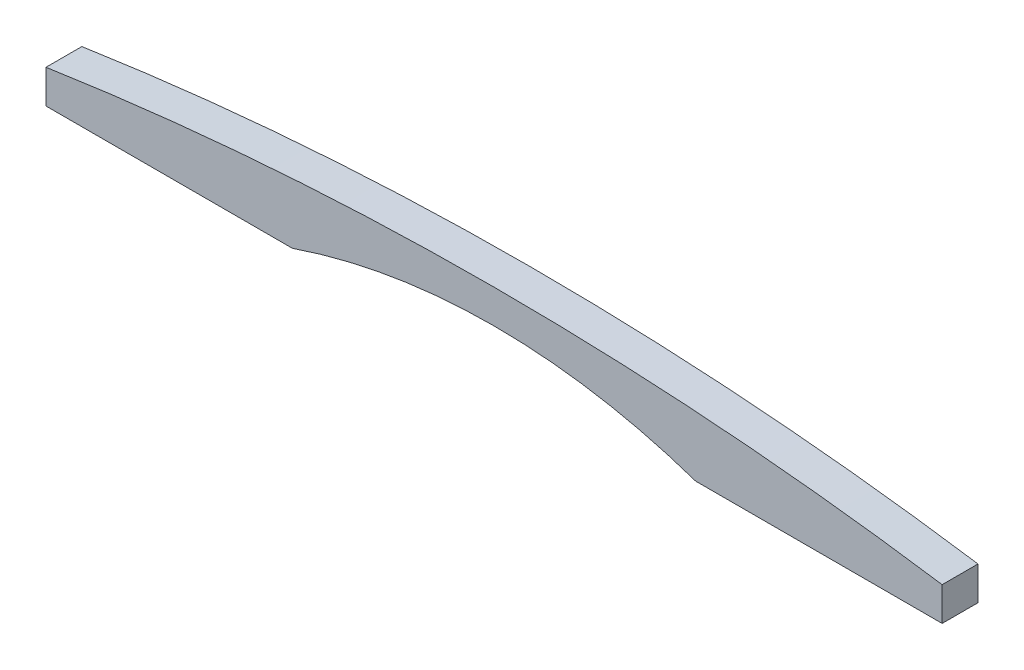
ISO-10303-21;
HEADER;
FILE_DESCRIPTION(('STEP AP214'),'2;1');
FILE_NAME('part.step','',(''),(''),'','','');
FILE_SCHEMA(('AUTOMOTIVE_DESIGN { 1 0 10303 214 1 1 1 1 }'));
ENDSEC;
DATA;
#1=APPLICATION_CONTEXT('core data for automotive mechanical design processes');
#2=APPLICATION_PROTOCOL_DEFINITION('international standard','automotive_design',2000,#1);
#3=PRODUCT_CONTEXT('',#1,'mechanical');
#4=PRODUCT('Part','Part','',(#3));
#5=PRODUCT_RELATED_PRODUCT_CATEGORY('part','',(#4));
#6=PRODUCT_DEFINITION_FORMATION('','',#4);
#7=PRODUCT_DEFINITION_CONTEXT('part definition',#1,'design');
#8=PRODUCT_DEFINITION('design','',#6,#7);
#9=PRODUCT_DEFINITION_SHAPE('','',#8);
#10=(LENGTH_UNIT() NAMED_UNIT(*) SI_UNIT(.MILLI.,.METRE.));
#11=(NAMED_UNIT(*) PLANE_ANGLE_UNIT() SI_UNIT($,.RADIAN.));
#12=(NAMED_UNIT(*) SI_UNIT($,.STERADIAN.) SOLID_ANGLE_UNIT());
#13=UNCERTAINTY_MEASURE_WITH_UNIT(LENGTH_MEASURE(1.E-05),#10,'distance_accuracy_value','');
#14=(GEOMETRIC_REPRESENTATION_CONTEXT(3) GLOBAL_UNCERTAINTY_ASSIGNED_CONTEXT((#13)) GLOBAL_UNIT_ASSIGNED_CONTEXT((#10,
#11,#12)) REPRESENTATION_CONTEXT('',''));
#15=CARTESIAN_POINT('',(0.,0.,0.));
#16=DIRECTION('',(0.,0.,1.));
#17=DIRECTION('',(1.,0.,0.));
#18=AXIS2_PLACEMENT_3D('',#15,#16,#17);
#19=CARTESIAN_POINT('',(100.,0.,8.));
#20=DIRECTION('',(0.,1.,0.));
#21=DIRECTION('',(-1.,0.,0.));
#22=AXIS2_PLACEMENT_3D('',#19,#20,#21);
#23=PLANE('',#22);
#24=DIRECTION('',(1.,0.,0.));
#25=VECTOR('',#24,1.);
#26=CARTESIAN_POINT('',(100.,0.,0.));
#27=LINE('',#26,#25);
#28=CARTESIAN_POINT('',(45.,0.,0.));
#29=VERTEX_POINT('',#28);
#30=CARTESIAN_POINT('',(100.,0.,0.));
#31=VERTEX_POINT('',#30);
#32=EDGE_CURVE('E116',#29,#31,#27,.T.);
#33=ORIENTED_EDGE('',*,*,#32,.T.);
#34=DIRECTION('',(0.,0.,-1.));
#35=VECTOR('',#34,1.);
#36=CARTESIAN_POINT('',(100.,0.,8.));
#37=LINE('',#36,#35);
#38=CARTESIAN_POINT('',(100.,0.,8.));
#39=VERTEX_POINT('',#38);
#40=EDGE_CURVE('E11',#39,#31,#37,.T.);
#41=ORIENTED_EDGE('',*,*,#40,.F.);
#42=DIRECTION('',(1.,0.,0.));
#43=VECTOR('',#42,1.);
#44=CARTESIAN_POINT('',(100.,0.,8.));
#45=LINE('',#44,#43);
#46=CARTESIAN_POINT('',(45.,0.,8.));
#47=VERTEX_POINT('',#46);
#48=EDGE_CURVE('E126',#47,#39,#45,.T.);
#49=ORIENTED_EDGE('',*,*,#48,.F.);
#50=DIRECTION('',(0.,0.,-1.));
#51=VECTOR('',#50,1.);
#52=CARTESIAN_POINT('',(45.,0.,8.));
#53=LINE('',#52,#51);
#54=EDGE_CURVE('E112',#47,#29,#53,.T.);
#55=ORIENTED_EDGE('',*,*,#54,.T.);
#56=EDGE_LOOP('',(#33,#41,#49,#55));
#57=FACE_BOUND('',#56,.T.);
#58=ADVANCED_FACE('F32',(#57),#23,.F.);
#59=CARTESIAN_POINT('',(100.,0.,8.));
#60=DIRECTION('',(-1.,0.,0.));
#61=DIRECTION('',(0.,0.,1.));
#62=AXIS2_PLACEMENT_3D('',#59,#60,#61);
#63=PLANE('',#62);
#64=DIRECTION('',(0.,1.,0.));
#65=VECTOR('',#64,1.);
#66=CARTESIAN_POINT('',(100.,0.,0.));
#67=LINE('',#66,#65);
#68=CARTESIAN_POINT('',(100.,7.5,0.));
#69=VERTEX_POINT('',#68);
#70=EDGE_CURVE('E119',#31,#69,#67,.T.);
#71=ORIENTED_EDGE('',*,*,#70,.T.);
#72=DIRECTION('',(0.,0.,-1.));
#73=VECTOR('',#72,1.);
#74=CARTESIAN_POINT('',(100.,7.5,8.));
#75=LINE('',#74,#73);
#76=CARTESIAN_POINT('',(100.,7.5,8.));
#77=VERTEX_POINT('',#76);
#78=EDGE_CURVE('E40',#77,#69,#75,.T.);
#79=ORIENTED_EDGE('',*,*,#78,.F.);
#80=DIRECTION('',(0.,1.,0.));
#81=VECTOR('',#80,1.);
#82=CARTESIAN_POINT('',(100.,0.,8.));
#83=LINE('',#82,#81);
#84=EDGE_CURVE('E85',#39,#77,#83,.T.);
#85=ORIENTED_EDGE('',*,*,#84,.F.);
#86=ORIENTED_EDGE('',*,*,#40,.T.);
#87=EDGE_LOOP('',(#71,#79,#85,#86));
#88=FACE_BOUND('',#87,.T.);
#89=ADVANCED_FACE('F150',(#88),#63,.F.);
#90=CARTESIAN_POINT('',(0.,-655.416666666667,8.));
#91=DIRECTION('',(0.,0.,-1.));
#92=DIRECTION('',(-1.,0.,0.));
#93=AXIS2_PLACEMENT_3D('',#90,#91,#92);
#94=CYLINDRICAL_SURFACE('',#93,670.416666666667);
#95=CARTESIAN_POINT('',(0.,-655.416666666667,0.));
#96=DIRECTION('',(0.,0.,1.));
#97=DIRECTION('',(-1.,0.,0.));
#98=AXIS2_PLACEMENT_3D('',#95,#96,#97);
#99=CIRCLE('',#98,670.416666666667);
#100=CARTESIAN_POINT('',(-100.,7.49999999999995,0.));
#101=VERTEX_POINT('',#100);
#102=EDGE_CURVE('E121',#69,#101,#99,.T.);
#103=ORIENTED_EDGE('',*,*,#102,.T.);
#104=DIRECTION('',(0.,0.,-1.));
#105=VECTOR('',#104,1.);
#106=CARTESIAN_POINT('',(-100.,7.49999999999995,8.));
#107=LINE('',#106,#105);
#108=CARTESIAN_POINT('',(-100.,7.49999999999995,8.));
#109=VERTEX_POINT('',#108);
#110=EDGE_CURVE('E107',#109,#101,#107,.T.);
#111=ORIENTED_EDGE('',*,*,#110,.F.);
#112=CARTESIAN_POINT('',(0.,-655.416666666667,8.));
#113=DIRECTION('',(0.,0.,1.));
#114=DIRECTION('',(-1.,0.,0.));
#115=AXIS2_PLACEMENT_3D('',#112,#113,#114);
#116=CIRCLE('',#115,670.416666666667);
#117=EDGE_CURVE('E98',#77,#109,#116,.T.);
#118=ORIENTED_EDGE('',*,*,#117,.F.);
#119=ORIENTED_EDGE('',*,*,#78,.T.);
#120=EDGE_LOOP('',(#103,#111,#118,#119));
#121=FACE_BOUND('',#120,.T.);
#122=ADVANCED_FACE('F132',(#121),#94,.T.);
#123=CARTESIAN_POINT('',(-100.,0.,8.));
#124=DIRECTION('',(1.,0.,0.));
#125=DIRECTION('',(0.,0.,-1.));
#126=AXIS2_PLACEMENT_3D('',#123,#124,#125);
#127=PLANE('',#126);
#128=DIRECTION('',(0.,-1.,0.));
#129=VECTOR('',#128,1.);
#130=CARTESIAN_POINT('',(-100.,0.,0.));
#131=LINE('',#130,#129);
#132=CARTESIAN_POINT('',(-100.,0.,0.));
#133=VERTEX_POINT('',#132);
#134=EDGE_CURVE('E106',#101,#133,#131,.T.);
#135=ORIENTED_EDGE('',*,*,#134,.T.);
#136=DIRECTION('',(0.,0.,-1.));
#137=VECTOR('',#136,1.);
#138=CARTESIAN_POINT('',(-100.,0.,8.));
#139=LINE('',#138,#137);
#140=CARTESIAN_POINT('',(-100.,0.,8.));
#141=VERTEX_POINT('',#140);
#142=EDGE_CURVE('E103',#141,#133,#139,.T.);
#143=ORIENTED_EDGE('',*,*,#142,.F.);
#144=DIRECTION('',(0.,-1.,0.));
#145=VECTOR('',#144,1.);
#146=CARTESIAN_POINT('',(-100.,0.,8.));
#147=LINE('',#146,#145);
#148=EDGE_CURVE('E92',#109,#141,#147,.T.);
#149=ORIENTED_EDGE('',*,*,#148,.F.);
#150=ORIENTED_EDGE('',*,*,#110,.T.);
#151=EDGE_LOOP('',(#135,#143,#149,#150));
#152=FACE_BOUND('',#151,.T.);
#153=ADVANCED_FACE('F104',(#152),#127,.F.);
#154=CARTESIAN_POINT('',(-100.,0.,8.));
#155=DIRECTION('',(0.,1.,0.));
#156=DIRECTION('',(-1.,0.,0.));
#157=AXIS2_PLACEMENT_3D('',#154,#155,#156);
#158=PLANE('',#157);
#159=DIRECTION('',(1.,0.,0.));
#160=VECTOR('',#159,1.);
#161=CARTESIAN_POINT('',(-100.,0.,0.));
#162=LINE('',#161,#160);
#163=CARTESIAN_POINT('',(-45.,0.,0.));
#164=VERTEX_POINT('',#163);
#165=EDGE_CURVE('E71',#133,#164,#162,.T.);
#166=ORIENTED_EDGE('',*,*,#165,.T.);
#167=DIRECTION('',(0.,0.,-1.));
#168=VECTOR('',#167,1.);
#169=CARTESIAN_POINT('',(-45.,0.,8.));
#170=LINE('',#169,#168);
#171=CARTESIAN_POINT('',(-45.,0.,8.));
#172=VERTEX_POINT('',#171);
#173=EDGE_CURVE('E108',#172,#164,#170,.T.);
#174=ORIENTED_EDGE('',*,*,#173,.F.);
#175=DIRECTION('',(1.,0.,0.));
#176=VECTOR('',#175,1.);
#177=CARTESIAN_POINT('',(-100.,0.,8.));
#178=LINE('',#177,#176);
#179=EDGE_CURVE('E96',#141,#172,#178,.T.);
#180=ORIENTED_EDGE('',*,*,#179,.F.);
#181=ORIENTED_EDGE('',*,*,#142,.T.);
#182=EDGE_LOOP('',(#166,#174,#180,#181));
#183=FACE_BOUND('',#182,.T.);
#184=ADVANCED_FACE('F110',(#183),#158,.F.);
#185=CARTESIAN_POINT('',(0.,-131.25,8.));
#186=DIRECTION('',(0.,0.,-1.));
#187=DIRECTION('',(-1.,0.,0.));
#188=AXIS2_PLACEMENT_3D('',#185,#186,#187);
#189=CYLINDRICAL_SURFACE('',#188,138.75);
#190=CARTESIAN_POINT('',(0.,-131.25,0.));
#191=DIRECTION('',(0.,0.,-1.));
#192=DIRECTION('',(-1.,0.,0.));
#193=AXIS2_PLACEMENT_3D('',#190,#191,#192);
#194=CIRCLE('',#193,138.75);
#195=EDGE_CURVE('E77',#164,#29,#194,.T.);
#196=ORIENTED_EDGE('',*,*,#195,.T.);
#197=ORIENTED_EDGE('',*,*,#54,.F.);
#198=CARTESIAN_POINT('',(0.,-131.25,8.));
#199=DIRECTION('',(0.,0.,-1.));
#200=DIRECTION('',(-1.,0.,0.));
#201=AXIS2_PLACEMENT_3D('',#198,#199,#200);
#202=CIRCLE('',#201,138.75);
#203=EDGE_CURVE('E48',#172,#47,#202,.T.);
#204=ORIENTED_EDGE('',*,*,#203,.F.);
#205=ORIENTED_EDGE('',*,*,#173,.T.);
#206=EDGE_LOOP('',(#196,#197,#204,#205));
#207=FACE_BOUND('',#206,.T.);
#208=ADVANCED_FACE('F139',(#207),#189,.F.);
#209=CARTESIAN_POINT('',(0.,-131.25,8.));
#210=DIRECTION('',(0.,0.,-1.));
#211=DIRECTION('',(-1.,0.,0.));
#212=AXIS2_PLACEMENT_3D('',#209,#210,#211);
#213=PLANE('',#212);
#214=ORIENTED_EDGE('',*,*,#48,.T.);
#215=ORIENTED_EDGE('',*,*,#84,.T.);
#216=ORIENTED_EDGE('',*,*,#117,.T.);
#217=ORIENTED_EDGE('',*,*,#148,.T.);
#218=ORIENTED_EDGE('',*,*,#179,.T.);
#219=ORIENTED_EDGE('',*,*,#203,.T.);
#220=EDGE_LOOP('',(#214,#215,#216,#217,#218,#219));
#221=FACE_BOUND('',#220,.T.);
#222=ADVANCED_FACE('F94',(#221),#213,.F.);
#223=CARTESIAN_POINT('',(0.,-131.25,0.));
#224=DIRECTION('',(0.,0.,-1.));
#225=DIRECTION('',(-1.,0.,0.));
#226=AXIS2_PLACEMENT_3D('',#223,#224,#225);
#227=PLANE('',#226);
#228=ORIENTED_EDGE('',*,*,#32,.F.);
#229=ORIENTED_EDGE('',*,*,#195,.F.);
#230=ORIENTED_EDGE('',*,*,#165,.F.);
#231=ORIENTED_EDGE('',*,*,#134,.F.);
#232=ORIENTED_EDGE('',*,*,#102,.F.);
#233=ORIENTED_EDGE('',*,*,#70,.F.);
#234=EDGE_LOOP('',(#228,#229,#230,#231,#232,#233));
#235=FACE_BOUND('',#234,.T.);
#236=ADVANCED_FACE('F135',(#235),#227,.T.);
#237=CLOSED_SHELL('',(#58,#89,#122,#153,#184,#208,#222,#236));
#238=MANIFOLD_SOLID_BREP('B2',#237);
#239=ADVANCED_BREP_SHAPE_REPRESENTATION('',(#18,#238),#14);
#240=SHAPE_DEFINITION_REPRESENTATION(#9,#239);
ENDSEC;
END-ISO-10303-21;
